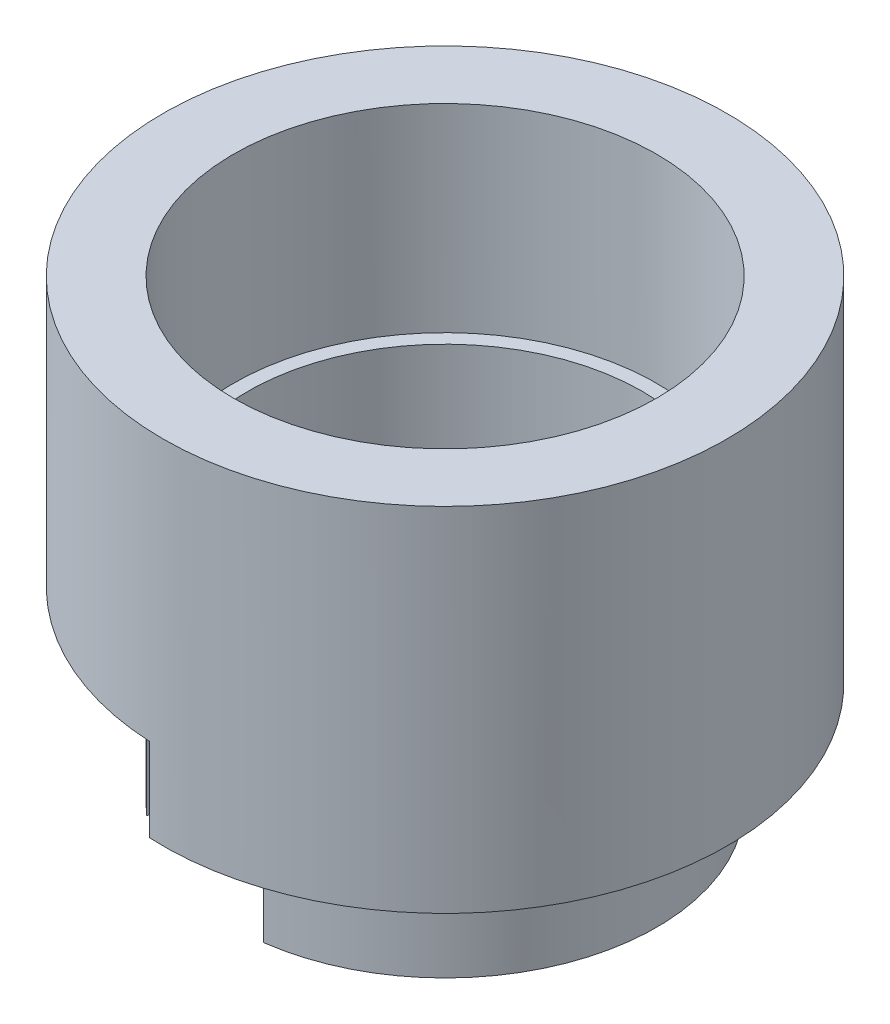
ISO-10303-21;
HEADER;
FILE_DESCRIPTION(('STEP AP214'),'2;1');
FILE_NAME('part.step','',(''),(''),'','','');
FILE_SCHEMA(('AUTOMOTIVE_DESIGN { 1 0 10303 214 1 1 1 1 }'));
ENDSEC;
DATA;
#1=APPLICATION_CONTEXT('core data for automotive mechanical design processes');
#2=APPLICATION_PROTOCOL_DEFINITION('international standard','automotive_design',2000,#1);
#3=PRODUCT_CONTEXT('',#1,'mechanical');
#4=PRODUCT('Part','Part','',(#3));
#5=PRODUCT_RELATED_PRODUCT_CATEGORY('part','',(#4));
#6=PRODUCT_DEFINITION_FORMATION('','',#4);
#7=PRODUCT_DEFINITION_CONTEXT('part definition',#1,'design');
#8=PRODUCT_DEFINITION('design','',#6,#7);
#9=PRODUCT_DEFINITION_SHAPE('','',#8);
#10=(LENGTH_UNIT() NAMED_UNIT(*) SI_UNIT(.MILLI.,.METRE.));
#11=(NAMED_UNIT(*) PLANE_ANGLE_UNIT() SI_UNIT($,.RADIAN.));
#12=(NAMED_UNIT(*) SI_UNIT($,.STERADIAN.) SOLID_ANGLE_UNIT());
#13=UNCERTAINTY_MEASURE_WITH_UNIT(LENGTH_MEASURE(1.E-05),#10,'distance_accuracy_value','');
#14=(GEOMETRIC_REPRESENTATION_CONTEXT(3) GLOBAL_UNCERTAINTY_ASSIGNED_CONTEXT((#13)) GLOBAL_UNIT_ASSIGNED_CONTEXT((#10,
#11,#12)) REPRESENTATION_CONTEXT('',''));
#15=CARTESIAN_POINT('',(0.,0.,0.));
#16=DIRECTION('',(0.,0.,1.));
#17=DIRECTION('',(1.,0.,0.));
#18=AXIS2_PLACEMENT_3D('',#15,#16,#17);
#19=CARTESIAN_POINT('',(0.,0.,0.));
#20=DIRECTION('',(0.,1.,0.));
#21=DIRECTION('',(0.,0.,1.));
#22=AXIS2_PLACEMENT_3D('',#19,#20,#21);
#23=PLANE('',#22);
#24=CARTESIAN_POINT('',(-14.4274561926336,0.,-19.8576898619304));
#25=DIRECTION('',(0.,-1.,0.));
#26=DIRECTION('',(0.,0.,-1.));
#27=AXIS2_PLACEMENT_3D('',#24,#25,#26);
#28=CIRCLE('',#27,1.02272727272727);
#29=CARTESIAN_POINT('',(-14.4274561926336,0.,-20.8804171346577));
#30=VERTEX_POINT('',#29);
#31=EDGE_CURVE('E252',#30,#30,#28,.T.);
#32=ORIENTED_EDGE('',*,*,#31,.F.);
#33=EDGE_LOOP('',(#32));
#34=FACE_BOUND('',#33,.T.);
#35=CARTESIAN_POINT('',(-23.3441144908811,0.,-7.58496258920303));
#36=DIRECTION('',(0.,-1.,0.));
#37=DIRECTION('',(0.,0.,-1.));
#38=AXIS2_PLACEMENT_3D('',#35,#36,#37);
#39=CIRCLE('',#38,1.02272727272727);
#40=CARTESIAN_POINT('',(-23.3441144908811,0.,-8.6076898619303));
#41=VERTEX_POINT('',#40);
#42=EDGE_CURVE('E235',#41,#41,#39,.T.);
#43=ORIENTED_EDGE('',*,*,#42,.F.);
#44=EDGE_LOOP('',(#43));
#45=FACE_BOUND('',#44,.T.);
#46=CARTESIAN_POINT('',(-23.344114490881,0.,7.58496258920352));
#47=DIRECTION('',(0.,-1.,0.));
#48=DIRECTION('',(0.,0.,-1.));
#49=AXIS2_PLACEMENT_3D('',#46,#47,#48);
#50=CIRCLE('',#49,1.02272727272727);
#51=CARTESIAN_POINT('',(-23.344114490881,0.,6.56223531647624));
#52=VERTEX_POINT('',#51);
#53=EDGE_CURVE('E206',#52,#52,#50,.T.);
#54=ORIENTED_EDGE('',*,*,#53,.F.);
#55=EDGE_LOOP('',(#54));
#56=FACE_BOUND('',#55,.T.);
#57=DIRECTION('',(-0.819178042205052,0.,0.573539305688021));
#58=VECTOR('',#57,1.);
#59=CARTESIAN_POINT('',(-2.60200663660479,0.,-3.71640911309731));
#60=LINE('',#59,#58);
#61=CARTESIAN_POINT('',(-20.6549486371412,0.,8.92317750563435));
#62=VERTEX_POINT('',#61);
#63=CARTESIAN_POINT('',(-24.6319495458198,0.,11.7076348792039));
#64=VERTEX_POINT('',#63);
#65=EDGE_CURVE('E171',#62,#64,#60,.T.);
#66=ORIENTED_EDGE('',*,*,#65,.T.);
#67=CARTESIAN_POINT('',(0.,0.,0.));
#68=DIRECTION('',(0.,1.,0.));
#69=DIRECTION('',(0.,0.,1.));
#70=AXIS2_PLACEMENT_3D('',#67,#68,#69);
#71=CIRCLE('',#70,27.2727272727273);
#72=CARTESIAN_POINT('',(-13.2994690319406,0.,-23.8102031986503));
#73=VERTEX_POINT('',#72);
#74=EDGE_CURVE('E41',#73,#64,#71,.T.);
#75=ORIENTED_EDGE('',*,*,#74,.F.);
#76=DIRECTION('',(-0.487647197837817,0.,-0.873040783950512));
#77=VECTOR('',#76,1.);
#78=CARTESIAN_POINT('',(0.,0.,0.));
#79=LINE('',#78,#77);
#80=CARTESIAN_POINT('',(-10.972061951351,0.,-19.6434176388865));
#81=VERTEX_POINT('',#80);
#82=EDGE_CURVE('E198',#81,#73,#79,.T.);
#83=ORIENTED_EDGE('',*,*,#82,.F.);
#84=CARTESIAN_POINT('',(0.,0.,0.));
#85=DIRECTION('',(0.,-1.,0.));
#86=DIRECTION('',(0.,0.,-1.));
#87=AXIS2_PLACEMENT_3D('',#84,#85,#86);
#88=CIRCLE('',#87,22.5);
#89=EDGE_CURVE('E195',#62,#81,#88,.T.);
#90=ORIENTED_EDGE('',*,*,#89,.F.);
#91=EDGE_LOOP('',(#66,#75,#83,#90));
#92=FACE_BOUND('',#91,.T.);
#93=ADVANCED_FACE('F32',(#34,#45,#56,#92),#23,.F.);
#94=CARTESIAN_POINT('',(0.,34.0909090909091,0.));
#95=DIRECTION('',(0.,-1.,0.));
#96=DIRECTION('',(0.,0.,-1.));
#97=AXIS2_PLACEMENT_3D('',#94,#95,#96);
#98=CYLINDRICAL_SURFACE('',#97,27.2727272727273);
#99=CARTESIAN_POINT('',(0.,34.0909090909091,0.));
#100=DIRECTION('',(0.,1.,0.));
#101=DIRECTION('',(0.,0.,1.));
#102=AXIS2_PLACEMENT_3D('',#99,#100,#101);
#103=CIRCLE('',#102,27.2727272727273);
#104=CARTESIAN_POINT('',(0.,34.0909090909091,27.2727272727273));
#105=VERTEX_POINT('',#104);
#106=EDGE_CURVE('E11',#105,#105,#103,.T.);
#107=ORIENTED_EDGE('',*,*,#106,.F.);
#108=EDGE_LOOP('',(#107));
#109=FACE_BOUND('',#108,.T.);
#110=DIRECTION('',(0.,-1.,0.));
#111=VECTOR('',#110,1.);
#112=CARTESIAN_POINT('',(-24.6319495458198,8.07952961590909,11.7076348792039));
#113=LINE('',#112,#111);
#114=CARTESIAN_POINT('',(-24.6319495458198,8.07952961590909,11.7076348792039));
#115=VERTEX_POINT('',#114);
#116=EDGE_CURVE('E204',#115,#64,#113,.T.);
#117=ORIENTED_EDGE('',*,*,#116,.F.);
#118=CARTESIAN_POINT('',(0.,8.07952961590909,0.));
#119=DIRECTION('',(0.,-1.,0.));
#120=DIRECTION('',(0.,0.,-1.));
#121=AXIS2_PLACEMENT_3D('',#118,#119,#120);
#122=CIRCLE('',#121,27.2727272727273);
#123=CARTESIAN_POINT('',(-1.32991168102371,8.07952961590909,27.2402824473837));
#124=VERTEX_POINT('',#123);
#125=EDGE_CURVE('E185',#124,#115,#122,.T.);
#126=ORIENTED_EDGE('',*,*,#125,.F.);
#127=DIRECTION('',(0.,-1.,0.));
#128=VECTOR('',#127,1.);
#129=CARTESIAN_POINT('',(-1.32991168102371,8.07952961590909,27.2402824473837));
#130=LINE('',#129,#128);
#131=CARTESIAN_POINT('',(-1.32991168102371,0.,27.2402824473837));
#132=VERTEX_POINT('',#131);
#133=EDGE_CURVE('E207',#124,#132,#130,.T.);
#134=ORIENTED_EDGE('',*,*,#133,.T.);
#135=CARTESIAN_POINT('',(2.86184323157071,0.,-27.1221589518695));
#136=VERTEX_POINT('',#135);
#137=EDGE_CURVE('E36',#132,#136,#71,.T.);
#138=ORIENTED_EDGE('',*,*,#137,.T.);
#139=DIRECTION('',(0.,-1.,0.));
#140=VECTOR('',#139,1.);
#141=CARTESIAN_POINT('',(2.86184323157071,8.07952961590909,-27.1221589518695));
#142=LINE('',#141,#140);
#143=CARTESIAN_POINT('',(2.86184323157071,8.07952961590909,-27.1221589518695));
#144=VERTEX_POINT('',#143);
#145=EDGE_CURVE('E215',#144,#136,#142,.T.);
#146=ORIENTED_EDGE('',*,*,#145,.F.);
#147=CARTESIAN_POINT('',(-13.2994690319406,8.07952961590909,-23.8102031986503));
#148=VERTEX_POINT('',#147);
#149=EDGE_CURVE('E181',#148,#144,#122,.T.);
#150=ORIENTED_EDGE('',*,*,#149,.F.);
#151=DIRECTION('',(0.,-1.,0.));
#152=VECTOR('',#151,1.);
#153=CARTESIAN_POINT('',(-13.2994690319406,8.07952961590909,-23.8102031986503));
#154=LINE('',#153,#152);
#155=EDGE_CURVE('E217',#148,#73,#154,.T.);
#156=ORIENTED_EDGE('',*,*,#155,.T.);
#157=ORIENTED_EDGE('',*,*,#74,.T.);
#158=EDGE_LOOP('',(#117,#126,#134,#138,#146,#150,#156,#157));
#159=FACE_BOUND('',#158,.T.);
#160=ADVANCED_FACE('F34',(#109,#159),#98,.T.);
#161=CARTESIAN_POINT('',(0.,34.0909090909091,0.));
#162=DIRECTION('',(0.,1.,0.));
#163=DIRECTION('',(0.,0.,1.));
#164=AXIS2_PLACEMENT_3D('',#161,#162,#163);
#165=PLANE('',#164);
#166=ORIENTED_EDGE('',*,*,#106,.T.);
#167=EDGE_LOOP('',(#166));
#168=FACE_BOUND('',#167,.T.);
#169=CARTESIAN_POINT('',(0.,34.0909090909091,0.));
#170=DIRECTION('',(0.,1.,0.));
#171=DIRECTION('',(0.,0.,1.));
#172=AXIS2_PLACEMENT_3D('',#169,#170,#171);
#173=CIRCLE('',#172,20.4545454545454);
#174=CARTESIAN_POINT('',(0.,34.0909090909091,20.4545454545454));
#175=VERTEX_POINT('',#174);
#176=EDGE_CURVE('E260',#175,#175,#173,.T.);
#177=ORIENTED_EDGE('',*,*,#176,.F.);
#178=EDGE_LOOP('',(#177));
#179=FACE_BOUND('',#178,.T.);
#180=ADVANCED_FACE('F295',(#168,#179),#165,.T.);
#181=CARTESIAN_POINT('',(14.4274561926335,0.,19.8576898619305));
#182=DIRECTION('',(0.,-1.,0.));
#183=DIRECTION('',(0.,0.,-1.));
#184=AXIS2_PLACEMENT_3D('',#181,#182,#183);
#185=CIRCLE('',#184,1.02272727272728);
#186=CARTESIAN_POINT('',(14.4274561926335,0.,18.8349625892032));
#187=VERTEX_POINT('',#186);
#188=EDGE_CURVE('E228',#187,#187,#185,.T.);
#189=ORIENTED_EDGE('',*,*,#188,.F.);
#190=EDGE_LOOP('',(#189));
#191=FACE_BOUND('',#190,.T.);
#192=CARTESIAN_POINT('',(23.344114490881,0.,-7.58496258920336));
#193=DIRECTION('',(0.,-1.,0.));
#194=DIRECTION('',(0.,0.,-1.));
#195=AXIS2_PLACEMENT_3D('',#192,#193,#194);
#196=CIRCLE('',#195,1.02272727272727);
#197=CARTESIAN_POINT('',(23.344114490881,0.,-8.60768986193063));
#198=VERTEX_POINT('',#197);
#199=EDGE_CURVE('E246',#198,#198,#196,.T.);
#200=ORIENTED_EDGE('',*,*,#199,.F.);
#201=EDGE_LOOP('',(#200));
#202=FACE_BOUND('',#201,.T.);
#203=CARTESIAN_POINT('',(23.3441144908811,0.,7.58496258920319));
#204=DIRECTION('',(0.,-1.,0.));
#205=DIRECTION('',(0.,0.,-1.));
#206=AXIS2_PLACEMENT_3D('',#203,#204,#205);
#207=CIRCLE('',#206,1.02272727272727);
#208=CARTESIAN_POINT('',(23.3441144908811,0.,6.56223531647592));
#209=VERTEX_POINT('',#208);
#210=EDGE_CURVE('E240',#209,#209,#207,.T.);
#211=ORIENTED_EDGE('',*,*,#210,.F.);
#212=EDGE_LOOP('',(#211));
#213=FACE_BOUND('',#212,.T.);
#214=ORIENTED_EDGE('',*,*,#137,.F.);
#215=DIRECTION('',(-0.0487634283041756,0.,0.998810356404069));
#216=VECTOR('',#215,1.);
#217=CARTESIAN_POINT('',(-7.34952928272318E-13,0.,0.));
#218=LINE('',#217,#216);
#219=CARTESIAN_POINT('',(-0.997433760767963,0.,20.4302118355377));
#220=VERTEX_POINT('',#219);
#221=EDGE_CURVE('E175',#220,#132,#218,.T.);
#222=ORIENTED_EDGE('',*,*,#221,.F.);
#223=CARTESIAN_POINT('',(0.,0.,0.));
#224=DIRECTION('',(0.,1.,0.));
#225=DIRECTION('',(0.,0.,1.));
#226=AXIS2_PLACEMENT_3D('',#223,#224,#225);
#227=CIRCLE('',#226,20.4545454545454);
#228=CARTESIAN_POINT('',(2.73329906518753,0.,20.2711002654595));
#229=VERTEX_POINT('',#228);
#230=EDGE_CURVE('E227',#220,#229,#227,.T.);
#231=ORIENTED_EDGE('',*,*,#230,.T.);
#232=CARTESIAN_POINT('',(0.,0.,0.));
#233=DIRECTION('',(0.,1.,0.));
#234=DIRECTION('',(0.,0.,1.));
#235=AXIS2_PLACEMENT_3D('',#232,#233,#234);
#236=CIRCLE('',#235,20.4545454545454);
#237=CARTESIAN_POINT('',(2.14638242367765,0.,-20.3416192139022));
#238=VERTEX_POINT('',#237);
#239=EDGE_CURVE('E165',#229,#238,#236,.T.);
#240=ORIENTED_EDGE('',*,*,#239,.T.);
#241=DIRECTION('',(0.104934251824316,0.,-0.994479161568542));
#242=VECTOR('',#241,1.);
#243=CARTESIAN_POINT('',(-1.54439806012414E-12,0.,-1.62959930404618E-13));
#244=LINE('',#243,#242);
#245=EDGE_CURVE('E200',#238,#136,#244,.T.);
#246=ORIENTED_EDGE('',*,*,#245,.T.);
#247=EDGE_LOOP('',(#214,#222,#231,#240,#246));
#248=FACE_BOUND('',#247,.T.);
#249=ADVANCED_FACE('F269',(#191,#202,#213,#248),#23,.F.);
#250=CARTESIAN_POINT('',(0.,34.0909090909091,0.));
#251=DIRECTION('',(0.,-1.,0.));
#252=DIRECTION('',(0.,0.,-1.));
#253=AXIS2_PLACEMENT_3D('',#250,#251,#252);
#254=CYLINDRICAL_SURFACE('',#253,20.4545454545454);
#255=DIRECTION('',(0.,-1.,0.));
#256=VECTOR('',#255,1.);
#257=CARTESIAN_POINT('',(2.73329906518752,14.8977114340909,20.2711002654595));
#258=LINE('',#257,#256);
#259=CARTESIAN_POINT('',(2.73329906518753,14.8977114340909,20.2711002654595));
#260=VERTEX_POINT('',#259);
#261=EDGE_CURVE('E166',#260,#229,#258,.T.);
#262=ORIENTED_EDGE('',*,*,#261,.T.);
#263=ORIENTED_EDGE('',*,*,#230,.F.);
#264=DIRECTION('',(0.,-1.,0.));
#265=VECTOR('',#264,1.);
#266=CARTESIAN_POINT('',(-0.997433760767963,8.07952961590909,20.4302118355377));
#267=LINE('',#266,#265);
#268=CARTESIAN_POINT('',(-0.997433760767963,8.07952961590909,20.4302118355377));
#269=VERTEX_POINT('',#268);
#270=EDGE_CURVE('E210',#269,#220,#267,.T.);
#271=ORIENTED_EDGE('',*,*,#270,.F.);
#272=CARTESIAN_POINT('',(0.,8.07952961590909,0.));
#273=DIRECTION('',(0.,-1.,0.));
#274=DIRECTION('',(0.,0.,-1.));
#275=AXIS2_PLACEMENT_3D('',#272,#273,#274);
#276=CIRCLE('',#275,20.4545454545454);
#277=CARTESIAN_POINT('',(-13.5744823650331,8.07952961590909,15.301041084628));
#278=VERTEX_POINT('',#277);
#279=EDGE_CURVE('E188',#269,#278,#276,.T.);
#280=ORIENTED_EDGE('',*,*,#279,.T.);
#281=DIRECTION('',(0.,-1.,0.));
#282=VECTOR('',#281,1.);
#283=CARTESIAN_POINT('',(-13.5744823650331,14.8977114340909,15.301041084628));
#284=LINE('',#283,#282);
#285=CARTESIAN_POINT('',(-13.5744823650331,14.8977114340909,15.301041084628));
#286=VERTEX_POINT('',#285);
#287=EDGE_CURVE('E53',#286,#278,#284,.T.);
#288=ORIENTED_EDGE('',*,*,#287,.F.);
#289=CARTESIAN_POINT('',(0.,14.8977114340909,0.));
#290=DIRECTION('',(0.,-1.,0.));
#291=DIRECTION('',(0.,0.,-1.));
#292=AXIS2_PLACEMENT_3D('',#289,#290,#291);
#293=CIRCLE('',#292,20.4545454545454);
#294=EDGE_CURVE('E48',#286,#260,#293,.T.);
#295=ORIENTED_EDGE('',*,*,#294,.T.);
#296=EDGE_LOOP('',(#262,#263,#271,#280,#288,#295));
#297=FACE_BOUND('',#296,.T.);
#298=ORIENTED_EDGE('',*,*,#176,.T.);
#299=EDGE_LOOP('',(#298));
#300=FACE_BOUND('',#299,.T.);
#301=ADVANCED_FACE('F301',(#297,#300),#254,.F.);
#302=CARTESIAN_POINT('',(23.3441144908811,6.81818181818182,7.58496258920319));
#303=DIRECTION('',(0.,-1.,0.));
#304=DIRECTION('',(0.,0.,-1.));
#305=AXIS2_PLACEMENT_3D('',#302,#303,#304);
#306=CYLINDRICAL_SURFACE('',#305,1.02272727272727);
#307=CARTESIAN_POINT('',(23.3441144908811,6.81818181818182,7.58496258920319));
#308=DIRECTION('',(0.,-1.,0.));
#309=DIRECTION('',(0.,0.,-1.));
#310=AXIS2_PLACEMENT_3D('',#307,#308,#309);
#311=CIRCLE('',#310,1.02272727272727);
#312=CARTESIAN_POINT('',(23.3441144908811,6.81818181818182,6.56223531647592));
#313=VERTEX_POINT('',#312);
#314=EDGE_CURVE('E231',#313,#313,#311,.T.);
#315=ORIENTED_EDGE('',*,*,#314,.F.);
#316=EDGE_LOOP('',(#315));
#317=FACE_BOUND('',#316,.T.);
#318=ORIENTED_EDGE('',*,*,#210,.T.);
#319=EDGE_LOOP('',(#318));
#320=FACE_BOUND('',#319,.T.);
#321=ADVANCED_FACE('F307',(#317,#320),#306,.F.);
#322=CARTESIAN_POINT('',(23.3441144908811,6.81818181818182,7.58496258920319));
#323=DIRECTION('',(0.,-1.,0.));
#324=DIRECTION('',(0.,0.,-1.));
#325=AXIS2_PLACEMENT_3D('',#322,#323,#324);
#326=PLANE('',#325);
#327=ORIENTED_EDGE('',*,*,#314,.T.);
#328=EDGE_LOOP('',(#327));
#329=FACE_BOUND('',#328,.T.);
#330=ADVANCED_FACE('F317',(#329),#326,.T.);
#331=CARTESIAN_POINT('',(23.344114490881,6.81818181818182,-7.58496258920336));
#332=DIRECTION('',(0.,-1.,0.));
#333=DIRECTION('',(0.,0.,-1.));
#334=AXIS2_PLACEMENT_3D('',#331,#332,#333);
#335=CYLINDRICAL_SURFACE('',#334,1.02272727272727);
#336=CARTESIAN_POINT('',(23.344114490881,6.81818181818182,-7.58496258920336));
#337=DIRECTION('',(0.,-1.,0.));
#338=DIRECTION('',(0.,0.,-1.));
#339=AXIS2_PLACEMENT_3D('',#336,#337,#338);
#340=CIRCLE('',#339,1.02272727272727);
#341=CARTESIAN_POINT('',(23.344114490881,6.81818181818182,-8.60768986193063));
#342=VERTEX_POINT('',#341);
#343=EDGE_CURVE('E243',#342,#342,#340,.T.);
#344=ORIENTED_EDGE('',*,*,#343,.F.);
#345=EDGE_LOOP('',(#344));
#346=FACE_BOUND('',#345,.T.);
#347=ORIENTED_EDGE('',*,*,#199,.T.);
#348=EDGE_LOOP('',(#347));
#349=FACE_BOUND('',#348,.T.);
#350=ADVANCED_FACE('F323',(#346,#349),#335,.F.);
#351=CARTESIAN_POINT('',(23.344114490881,6.81818181818182,-7.58496258920336));
#352=DIRECTION('',(0.,-1.,0.));
#353=DIRECTION('',(0.,0.,-1.));
#354=AXIS2_PLACEMENT_3D('',#351,#352,#353);
#355=PLANE('',#354);
#356=ORIENTED_EDGE('',*,*,#343,.T.);
#357=EDGE_LOOP('',(#356));
#358=FACE_BOUND('',#357,.T.);
#359=ADVANCED_FACE('F329',(#358),#355,.T.);
#360=CARTESIAN_POINT('',(-14.4274561926336,6.81818181818182,-19.8576898619304));
#361=DIRECTION('',(0.,-1.,0.));
#362=DIRECTION('',(0.,0.,-1.));
#363=AXIS2_PLACEMENT_3D('',#360,#361,#362);
#364=CYLINDRICAL_SURFACE('',#363,1.02272727272727);
#365=CARTESIAN_POINT('',(-14.4274561926336,6.81818181818182,-19.8576898619304));
#366=DIRECTION('',(0.,-1.,0.));
#367=DIRECTION('',(0.,0.,-1.));
#368=AXIS2_PLACEMENT_3D('',#365,#366,#367);
#369=CIRCLE('',#368,1.02272727272727);
#370=CARTESIAN_POINT('',(-14.4274561926336,6.81818181818182,-20.8804171346577));
#371=VERTEX_POINT('',#370);
#372=EDGE_CURVE('E249',#371,#371,#369,.T.);
#373=ORIENTED_EDGE('',*,*,#372,.F.);
#374=EDGE_LOOP('',(#373));
#375=FACE_BOUND('',#374,.T.);
#376=ORIENTED_EDGE('',*,*,#31,.T.);
#377=EDGE_LOOP('',(#376));
#378=FACE_BOUND('',#377,.T.);
#379=ADVANCED_FACE('F332',(#375,#378),#364,.F.);
#380=CARTESIAN_POINT('',(-14.4274561926336,6.81818181818182,-19.8576898619304));
#381=DIRECTION('',(0.,-1.,0.));
#382=DIRECTION('',(0.,0.,-1.));
#383=AXIS2_PLACEMENT_3D('',#380,#381,#382);
#384=PLANE('',#383);
#385=ORIENTED_EDGE('',*,*,#372,.T.);
#386=EDGE_LOOP('',(#385));
#387=FACE_BOUND('',#386,.T.);
#388=ADVANCED_FACE('F337',(#387),#384,.T.);
#389=CARTESIAN_POINT('',(-23.3441144908811,6.81818181818182,-7.58496258920303));
#390=DIRECTION('',(0.,-1.,0.));
#391=DIRECTION('',(0.,0.,-1.));
#392=AXIS2_PLACEMENT_3D('',#389,#390,#391);
#393=CYLINDRICAL_SURFACE('',#392,1.02272727272727);
#394=CARTESIAN_POINT('',(-23.3441144908811,6.81818181818182,-7.58496258920303));
#395=DIRECTION('',(0.,-1.,0.));
#396=DIRECTION('',(0.,0.,-1.));
#397=AXIS2_PLACEMENT_3D('',#394,#395,#396);
#398=CIRCLE('',#397,1.02272727272727);
#399=CARTESIAN_POINT('',(-23.3441144908811,6.81818181818182,-8.6076898619303));
#400=VERTEX_POINT('',#399);
#401=EDGE_CURVE('E255',#400,#400,#398,.T.);
#402=ORIENTED_EDGE('',*,*,#401,.F.);
#403=EDGE_LOOP('',(#402));
#404=FACE_BOUND('',#403,.T.);
#405=ORIENTED_EDGE('',*,*,#42,.T.);
#406=EDGE_LOOP('',(#405));
#407=FACE_BOUND('',#406,.T.);
#408=ADVANCED_FACE('F340',(#404,#407),#393,.F.);
#409=CARTESIAN_POINT('',(-23.3441144908811,6.81818181818182,-7.58496258920303));
#410=DIRECTION('',(0.,-1.,0.));
#411=DIRECTION('',(0.,0.,-1.));
#412=AXIS2_PLACEMENT_3D('',#409,#410,#411);
#413=PLANE('',#412);
#414=ORIENTED_EDGE('',*,*,#401,.T.);
#415=EDGE_LOOP('',(#414));
#416=FACE_BOUND('',#415,.T.);
#417=ADVANCED_FACE('F345',(#416),#413,.T.);
#418=CARTESIAN_POINT('',(-23.344114490881,6.81818181818182,7.58496258920352));
#419=DIRECTION('',(0.,-1.,0.));
#420=DIRECTION('',(0.,0.,-1.));
#421=AXIS2_PLACEMENT_3D('',#418,#419,#420);
#422=CYLINDRICAL_SURFACE('',#421,1.02272727272727);
#423=CARTESIAN_POINT('',(-23.344114490881,6.81818181818182,7.58496258920352));
#424=DIRECTION('',(0.,-1.,0.));
#425=DIRECTION('',(0.,0.,-1.));
#426=AXIS2_PLACEMENT_3D('',#423,#424,#425);
#427=CIRCLE('',#426,1.02272727272727);
#428=CARTESIAN_POINT('',(-23.344114490881,6.81818181818182,6.56223531647624));
#429=VERTEX_POINT('',#428);
#430=EDGE_CURVE('E232',#429,#429,#427,.T.);
#431=ORIENTED_EDGE('',*,*,#430,.F.);
#432=EDGE_LOOP('',(#431));
#433=FACE_BOUND('',#432,.T.);
#434=ORIENTED_EDGE('',*,*,#53,.T.);
#435=EDGE_LOOP('',(#434));
#436=FACE_BOUND('',#435,.T.);
#437=ADVANCED_FACE('F348',(#433,#436),#422,.F.);
#438=CARTESIAN_POINT('',(-23.344114490881,6.81818181818182,7.58496258920352));
#439=DIRECTION('',(0.,-1.,0.));
#440=DIRECTION('',(0.,0.,-1.));
#441=AXIS2_PLACEMENT_3D('',#438,#439,#440);
#442=PLANE('',#441);
#443=ORIENTED_EDGE('',*,*,#430,.T.);
#444=EDGE_LOOP('',(#443));
#445=FACE_BOUND('',#444,.T.);
#446=ADVANCED_FACE('F414',(#445),#442,.T.);
#447=CARTESIAN_POINT('',(14.4274561926335,6.81818181818182,19.8576898619305));
#448=DIRECTION('',(0.,-1.,0.));
#449=DIRECTION('',(0.,0.,-1.));
#450=AXIS2_PLACEMENT_3D('',#447,#448,#449);
#451=CYLINDRICAL_SURFACE('',#450,1.02272727272728);
#452=CARTESIAN_POINT('',(14.4274561926335,6.81818181818182,19.8576898619305));
#453=DIRECTION('',(0.,-1.,0.));
#454=DIRECTION('',(0.,0.,-1.));
#455=AXIS2_PLACEMENT_3D('',#452,#453,#454);
#456=CIRCLE('',#455,1.02272727272728);
#457=CARTESIAN_POINT('',(14.4274561926335,6.81818181818182,18.8349625892032));
#458=VERTEX_POINT('',#457);
#459=EDGE_CURVE('E224',#458,#458,#456,.T.);
#460=ORIENTED_EDGE('',*,*,#459,.F.);
#461=EDGE_LOOP('',(#460));
#462=FACE_BOUND('',#461,.T.);
#463=ORIENTED_EDGE('',*,*,#188,.T.);
#464=EDGE_LOOP('',(#463));
#465=FACE_BOUND('',#464,.T.);
#466=ADVANCED_FACE('F410',(#462,#465),#451,.F.);
#467=CARTESIAN_POINT('',(14.4274561926335,6.81818181818182,19.8576898619305));
#468=DIRECTION('',(0.,-1.,0.));
#469=DIRECTION('',(0.,0.,-1.));
#470=AXIS2_PLACEMENT_3D('',#467,#468,#469);
#471=PLANE('',#470);
#472=ORIENTED_EDGE('',*,*,#459,.T.);
#473=EDGE_LOOP('',(#472));
#474=FACE_BOUND('',#473,.T.);
#475=ADVANCED_FACE('F399',(#474),#471,.T.);
#476=CARTESIAN_POINT('',(-2.60200663660479,8.07952961590909,-3.71640911309731));
#477=DIRECTION('',(0.573539305688021,0.,0.819178042205052));
#478=DIRECTION('',(0.819178042205053,0.,-0.573539305688021));
#479=AXIS2_PLACEMENT_3D('',#476,#477,#478);
#480=PLANE('',#479);
#481=ORIENTED_EDGE('',*,*,#65,.F.);
#482=DIRECTION('',(0.,-1.,0.));
#483=VECTOR('',#482,1.);
#484=CARTESIAN_POINT('',(-20.6549486371412,8.07952961590909,8.92317750563435));
#485=LINE('',#484,#483);
#486=CARTESIAN_POINT('',(-20.6549486371412,8.07952961590909,8.92317750563435));
#487=VERTEX_POINT('',#486);
#488=EDGE_CURVE('E222',#487,#62,#485,.T.);
#489=ORIENTED_EDGE('',*,*,#488,.F.);
#490=DIRECTION('',(-0.819178042205052,0.,0.573539305688021));
#491=VECTOR('',#490,1.);
#492=CARTESIAN_POINT('',(-2.60200663660479,8.07952961590909,-3.71640911309731));
#493=LINE('',#492,#491);
#494=EDGE_CURVE('E172',#487,#115,#493,.T.);
#495=ORIENTED_EDGE('',*,*,#494,.T.);
#496=ORIENTED_EDGE('',*,*,#116,.T.);
#497=EDGE_LOOP('',(#481,#489,#495,#496));
#498=FACE_BOUND('',#497,.T.);
#499=ADVANCED_FACE('F384',(#498),#480,.T.);
#500=CARTESIAN_POINT('',(-7.34952928272318E-13,8.07952961590909,0.));
#501=DIRECTION('',(0.998810356404069,0.,0.0487634283041756));
#502=DIRECTION('',(0.0487634283041756,0.,-0.998810356404069));
#503=AXIS2_PLACEMENT_3D('',#500,#501,#502);
#504=PLANE('',#503);
#505=ORIENTED_EDGE('',*,*,#221,.T.);
#506=ORIENTED_EDGE('',*,*,#133,.F.);
#507=DIRECTION('',(-0.0487634283041756,0.,0.998810356404069));
#508=VECTOR('',#507,1.);
#509=CARTESIAN_POINT('',(-7.34952928272318E-13,8.07952961590909,0.));
#510=LINE('',#509,#508);
#511=EDGE_CURVE('E190',#269,#124,#510,.T.);
#512=ORIENTED_EDGE('',*,*,#511,.F.);
#513=ORIENTED_EDGE('',*,*,#270,.T.);
#514=EDGE_LOOP('',(#505,#506,#512,#513));
#515=FACE_BOUND('',#514,.T.);
#516=ADVANCED_FACE('F388',(#515),#504,.F.);
#517=CARTESIAN_POINT('',(-1.54439806012414E-12,8.07952961590909,-1.62959930404618E-13));
#518=DIRECTION('',(-0.994479161568543,0.,-0.104934251824316));
#519=DIRECTION('',(-0.104934251824316,0.,0.994479161568543));
#520=AXIS2_PLACEMENT_3D('',#517,#518,#519);
#521=PLANE('',#520);
#522=ORIENTED_EDGE('',*,*,#245,.F.);
#523=DIRECTION('',(0.,-1.,0.));
#524=VECTOR('',#523,1.);
#525=CARTESIAN_POINT('',(2.14638242367765,8.07952961590909,-20.3416192139022));
#526=LINE('',#525,#524);
#527=CARTESIAN_POINT('',(2.14638242367765,8.07952961590909,-20.3416192139022));
#528=VERTEX_POINT('',#527);
#529=EDGE_CURVE('E212',#528,#238,#526,.T.);
#530=ORIENTED_EDGE('',*,*,#529,.F.);
#531=DIRECTION('',(0.104934251824316,0.,-0.994479161568542));
#532=VECTOR('',#531,1.);
#533=CARTESIAN_POINT('',(-1.54439806012414E-12,8.07952961590909,-1.62959930404618E-13));
#534=LINE('',#533,#532);
#535=EDGE_CURVE('E184',#528,#144,#534,.T.);
#536=ORIENTED_EDGE('',*,*,#535,.T.);
#537=ORIENTED_EDGE('',*,*,#145,.T.);
#538=EDGE_LOOP('',(#522,#530,#536,#537));
#539=FACE_BOUND('',#538,.T.);
#540=ADVANCED_FACE('F373',(#539),#521,.T.);
#541=CARTESIAN_POINT('',(0.,8.07952961590909,0.));
#542=DIRECTION('',(-0.873040783950512,0.,0.487647197837817));
#543=DIRECTION('',(0.487647197837817,0.,0.873040783950512));
#544=AXIS2_PLACEMENT_3D('',#541,#542,#543);
#545=PLANE('',#544);
#546=ORIENTED_EDGE('',*,*,#82,.T.);
#547=ORIENTED_EDGE('',*,*,#155,.F.);
#548=DIRECTION('',(-0.487647197837817,0.,-0.873040783950512));
#549=VECTOR('',#548,1.);
#550=CARTESIAN_POINT('',(0.,8.07952961590909,0.));
#551=LINE('',#550,#549);
#552=CARTESIAN_POINT('',(-10.972061951351,8.07952961590909,-19.6434176388865));
#553=VERTEX_POINT('',#552);
#554=EDGE_CURVE('E178',#553,#148,#551,.T.);
#555=ORIENTED_EDGE('',*,*,#554,.F.);
#556=DIRECTION('',(0.,-1.,0.));
#557=VECTOR('',#556,1.);
#558=CARTESIAN_POINT('',(-10.972061951351,8.07952961590909,-19.6434176388865));
#559=LINE('',#558,#557);
#560=EDGE_CURVE('E220',#553,#81,#559,.T.);
#561=ORIENTED_EDGE('',*,*,#560,.T.);
#562=EDGE_LOOP('',(#546,#547,#555,#561));
#563=FACE_BOUND('',#562,.T.);
#564=ADVANCED_FACE('F381',(#563),#545,.F.);
#565=CARTESIAN_POINT('',(0.,8.07952961590909,0.));
#566=DIRECTION('',(0.,-1.,0.));
#567=DIRECTION('',(0.,0.,-1.));
#568=AXIS2_PLACEMENT_3D('',#565,#566,#567);
#569=CYLINDRICAL_SURFACE('',#568,22.5);
#570=ORIENTED_EDGE('',*,*,#89,.T.);
#571=ORIENTED_EDGE('',*,*,#560,.F.);
#572=CARTESIAN_POINT('',(0.,8.07952961590909,0.));
#573=DIRECTION('',(0.,-1.,0.));
#574=DIRECTION('',(0.,0.,-1.));
#575=AXIS2_PLACEMENT_3D('',#572,#573,#574);
#576=CIRCLE('',#575,22.5);
#577=EDGE_CURVE('E174',#487,#553,#576,.T.);
#578=ORIENTED_EDGE('',*,*,#577,.F.);
#579=ORIENTED_EDGE('',*,*,#488,.T.);
#580=EDGE_LOOP('',(#570,#571,#578,#579));
#581=FACE_BOUND('',#580,.T.);
#582=ADVANCED_FACE('F383',(#581),#569,.F.);
#583=CARTESIAN_POINT('',(0.,8.07952961590909,0.));
#584=DIRECTION('',(0.,-1.,0.));
#585=DIRECTION('',(0.,0.,-1.));
#586=AXIS2_PLACEMENT_3D('',#583,#584,#585);
#587=PLANE('',#586);
#588=ORIENTED_EDGE('',*,*,#494,.F.);
#589=ORIENTED_EDGE('',*,*,#577,.T.);
#590=ORIENTED_EDGE('',*,*,#554,.T.);
#591=ORIENTED_EDGE('',*,*,#149,.T.);
#592=ORIENTED_EDGE('',*,*,#535,.F.);
#593=EDGE_CURVE('E187',#278,#528,#276,.T.);
#594=ORIENTED_EDGE('',*,*,#593,.F.);
#595=ORIENTED_EDGE('',*,*,#279,.F.);
#596=ORIENTED_EDGE('',*,*,#511,.T.);
#597=ORIENTED_EDGE('',*,*,#125,.T.);
#598=EDGE_LOOP('',(#588,#589,#590,#591,#592,#594,#595,#596,#597));
#599=FACE_BOUND('',#598,.T.);
#600=ADVANCED_FACE('F377',(#599),#587,.T.);
#601=CARTESIAN_POINT('',(0.,14.8977114340909,0.));
#602=DIRECTION('',(0.,-1.,0.));
#603=DIRECTION('',(0.,0.,-1.));
#604=AXIS2_PLACEMENT_3D('',#601,#602,#603);
#605=CYLINDRICAL_SURFACE('',#604,20.4545454545454);
#606=ORIENTED_EDGE('',*,*,#239,.F.);
#607=CARTESIAN_POINT('',(2.73329906518752,-10.2272727272727,20.2711002654595));
#608=VERTEX_POINT('',#607);
#609=EDGE_CURVE('E168',#229,#608,#258,.T.);
#610=ORIENTED_EDGE('',*,*,#609,.T.);
#611=CARTESIAN_POINT('',(0.,-10.2272727272727,0.));
#612=DIRECTION('',(0.,-1.,0.));
#613=DIRECTION('',(0.,0.,-1.));
#614=AXIS2_PLACEMENT_3D('',#611,#612,#613);
#615=CIRCLE('',#614,20.4545454545454);
#616=CARTESIAN_POINT('',(-13.5744823650331,-10.2272727272727,15.301041084628));
#617=VERTEX_POINT('',#616);
#618=EDGE_CURVE('E147',#617,#608,#615,.T.);
#619=ORIENTED_EDGE('',*,*,#618,.F.);
#620=EDGE_CURVE('E137',#278,#617,#284,.T.);
#621=ORIENTED_EDGE('',*,*,#620,.F.);
#622=ORIENTED_EDGE('',*,*,#593,.T.);
#623=ORIENTED_EDGE('',*,*,#529,.T.);
#624=EDGE_LOOP('',(#606,#610,#619,#621,#622,#623));
#625=FACE_BOUND('',#624,.T.);
#626=ADVANCED_FACE('F274',(#625),#605,.T.);
#627=CARTESIAN_POINT('',(0.,14.8977114340909,0.));
#628=DIRECTION('',(0.,-1.,0.));
#629=DIRECTION('',(0.,0.,-1.));
#630=AXIS2_PLACEMENT_3D('',#627,#628,#629);
#631=CYLINDRICAL_SURFACE('',#630,19.0909090909091);
#632=DIRECTION('',(0.,-1.,0.));
#633=VECTOR('',#632,1.);
#634=CARTESIAN_POINT('',(-13.1115398856388,14.8977114340909,13.8762506371374));
#635=LINE('',#634,#633);
#636=CARTESIAN_POINT('',(-13.1115398856388,14.8977114340909,13.8762506371374));
#637=VERTEX_POINT('',#636);
#638=CARTESIAN_POINT('',(-13.1115398856388,-10.2272727272727,13.8762506371374));
#639=VERTEX_POINT('',#638);
#640=EDGE_CURVE('E127',#637,#639,#635,.T.);
#641=ORIENTED_EDGE('',*,*,#640,.T.);
#642=CARTESIAN_POINT('',(0.,-10.2272727272727,0.));
#643=DIRECTION('',(0.,1.,0.));
#644=DIRECTION('',(0.,0.,-1.));
#645=AXIS2_PLACEMENT_3D('',#642,#643,#644);
#646=CIRCLE('',#645,19.0909090909091);
#647=CARTESIAN_POINT('',(3.2047925881654,-10.2272727272727,18.8199924119059));
#648=VERTEX_POINT('',#647);
#649=EDGE_CURVE('E131',#648,#639,#646,.T.);
#650=ORIENTED_EDGE('',*,*,#649,.F.);
#651=DIRECTION('',(0.,-1.,0.));
#652=VECTOR('',#651,1.);
#653=CARTESIAN_POINT('',(3.2047925881654,14.8977114340909,18.8199924119059));
#654=LINE('',#653,#652);
#655=CARTESIAN_POINT('',(3.2047925881654,14.8977114340909,18.8199924119059));
#656=VERTEX_POINT('',#655);
#657=EDGE_CURVE('E163',#656,#648,#654,.T.);
#658=ORIENTED_EDGE('',*,*,#657,.F.);
#659=CARTESIAN_POINT('',(0.,14.8977114340909,0.));
#660=DIRECTION('',(0.,1.,0.));
#661=DIRECTION('',(0.,0.,-1.));
#662=AXIS2_PLACEMENT_3D('',#659,#660,#661);
#663=CIRCLE('',#662,19.0909090909091);
#664=EDGE_CURVE('E133',#656,#637,#663,.T.);
#665=ORIENTED_EDGE('',*,*,#664,.T.);
#666=EDGE_LOOP('',(#641,#650,#658,#665));
#667=FACE_BOUND('',#666,.T.);
#668=ADVANCED_FACE('F129',(#667),#631,.F.);
#669=CARTESIAN_POINT('',(2.73329906518753,14.8977114340909,20.2711002654595));
#670=DIRECTION('',(-0.951056516295143,0.,-0.309016994374979));
#671=DIRECTION('',(-0.309016994374979,0.,0.951056516295143));
#672=AXIS2_PLACEMENT_3D('',#669,#670,#671);
#673=PLANE('',#672);
#674=ORIENTED_EDGE('',*,*,#657,.T.);
#675=DIRECTION('',(0.309016994374979,0.,-0.951056516295143));
#676=VECTOR('',#675,1.);
#677=CARTESIAN_POINT('',(2.73329906518753,-10.2272727272727,20.2711002654595));
#678=LINE('',#677,#676);
#679=EDGE_CURVE('E152',#608,#648,#678,.T.);
#680=ORIENTED_EDGE('',*,*,#679,.F.);
#681=ORIENTED_EDGE('',*,*,#609,.F.);
#682=ORIENTED_EDGE('',*,*,#261,.F.);
#683=DIRECTION('',(0.309016994374979,0.,-0.951056516295143));
#684=VECTOR('',#683,1.);
#685=CARTESIAN_POINT('',(2.73329906518753,14.8977114340909,20.2711002654595));
#686=LINE('',#685,#684);
#687=EDGE_CURVE('E138',#260,#656,#686,.T.);
#688=ORIENTED_EDGE('',*,*,#687,.T.);
#689=EDGE_LOOP('',(#674,#680,#681,#682,#688));
#690=FACE_BOUND('',#689,.T.);
#691=ADVANCED_FACE('F277',(#690),#673,.T.);
#692=CARTESIAN_POINT('',(-13.5744823650331,14.8977114340909,15.301041084628));
#693=DIRECTION('',(0.951056516295143,0.,0.309016994374979));
#694=DIRECTION('',(0.309016994374979,0.,-0.951056516295143));
#695=AXIS2_PLACEMENT_3D('',#692,#693,#694);
#696=PLANE('',#695);
#697=ORIENTED_EDGE('',*,*,#287,.T.);
#698=ORIENTED_EDGE('',*,*,#620,.T.);
#699=DIRECTION('',(-0.309016994374979,0.,0.951056516295143));
#700=VECTOR('',#699,1.);
#701=CARTESIAN_POINT('',(-13.5744823650331,-10.2272727272727,15.301041084628));
#702=LINE('',#701,#700);
#703=EDGE_CURVE('E141',#639,#617,#702,.T.);
#704=ORIENTED_EDGE('',*,*,#703,.F.);
#705=ORIENTED_EDGE('',*,*,#640,.F.);
#706=DIRECTION('',(-0.309016994374979,0.,0.951056516295143));
#707=VECTOR('',#706,1.);
#708=CARTESIAN_POINT('',(-13.5744823650331,14.8977114340909,15.301041084628));
#709=LINE('',#708,#707);
#710=EDGE_CURVE('E158',#637,#286,#709,.T.);
#711=ORIENTED_EDGE('',*,*,#710,.T.);
#712=EDGE_LOOP('',(#697,#698,#704,#705,#711));
#713=FACE_BOUND('',#712,.T.);
#714=ADVANCED_FACE('F142',(#713),#696,.T.);
#715=CARTESIAN_POINT('',(0.,14.8977114340909,0.));
#716=DIRECTION('',(0.,-1.,0.));
#717=DIRECTION('',(0.,0.,-1.));
#718=AXIS2_PLACEMENT_3D('',#715,#716,#717);
#719=PLANE('',#718);
#720=ORIENTED_EDGE('',*,*,#664,.F.);
#721=ORIENTED_EDGE('',*,*,#687,.F.);
#722=ORIENTED_EDGE('',*,*,#294,.F.);
#723=ORIENTED_EDGE('',*,*,#710,.F.);
#724=EDGE_LOOP('',(#720,#721,#722,#723));
#725=FACE_BOUND('',#724,.T.);
#726=ADVANCED_FACE('F280',(#725),#719,.F.);
#727=CARTESIAN_POINT('',(0.,-10.2272727272727,0.));
#728=DIRECTION('',(0.,-1.,0.));
#729=DIRECTION('',(0.,0.,-1.));
#730=AXIS2_PLACEMENT_3D('',#727,#728,#729);
#731=PLANE('',#730);
#732=ORIENTED_EDGE('',*,*,#649,.T.);
#733=ORIENTED_EDGE('',*,*,#703,.T.);
#734=ORIENTED_EDGE('',*,*,#618,.T.);
#735=ORIENTED_EDGE('',*,*,#679,.T.);
#736=EDGE_LOOP('',(#732,#733,#734,#735));
#737=FACE_BOUND('',#736,.T.);
#738=ADVANCED_FACE('F150',(#737),#731,.T.);
#739=CLOSED_SHELL('',(#93,#160,#180,#249,#301,#321,#330,#350,#359,#379,#388,#408,#417,#437,#446,
#466,#475,#499,#516,#540,#564,#582,#600,#626,#668,#691,#714,#726,#738));
#740=MANIFOLD_SOLID_BREP('B2',#739);
#741=ADVANCED_BREP_SHAPE_REPRESENTATION('',(#18,#740),#14);
#742=SHAPE_DEFINITION_REPRESENTATION(#9,#741);
ENDSEC;
END-ISO-10303-21;
